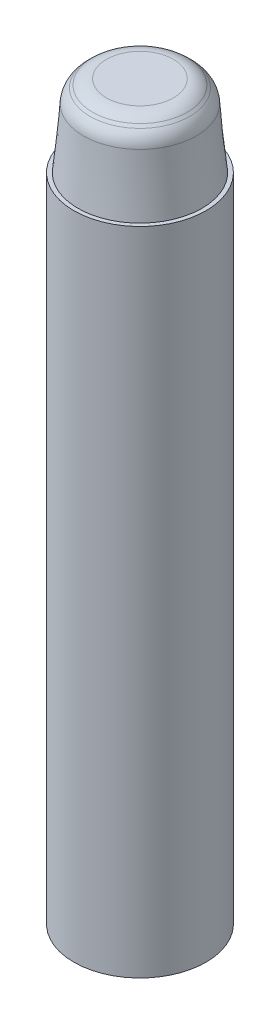
ISO-10303-21;
HEADER;
FILE_DESCRIPTION(('STEP AP214'),'2;1');
FILE_NAME('part.step','',(''),(''),'','','');
FILE_SCHEMA(('AUTOMOTIVE_DESIGN { 1 0 10303 214 1 1 1 1 }'));
ENDSEC;
DATA;
#1=APPLICATION_CONTEXT('core data for automotive mechanical design processes');
#2=APPLICATION_PROTOCOL_DEFINITION('international standard','automotive_design',2000,#1);
#3=PRODUCT_CONTEXT('',#1,'mechanical');
#4=PRODUCT('Part','Part','',(#3));
#5=PRODUCT_RELATED_PRODUCT_CATEGORY('part','',(#4));
#6=PRODUCT_DEFINITION_FORMATION('','',#4);
#7=PRODUCT_DEFINITION_CONTEXT('part definition',#1,'design');
#8=PRODUCT_DEFINITION('design','',#6,#7);
#9=PRODUCT_DEFINITION_SHAPE('','',#8);
#10=(LENGTH_UNIT() NAMED_UNIT(*) SI_UNIT(.MILLI.,.METRE.));
#11=(NAMED_UNIT(*) PLANE_ANGLE_UNIT() SI_UNIT($,.RADIAN.));
#12=(NAMED_UNIT(*) SI_UNIT($,.STERADIAN.) SOLID_ANGLE_UNIT());
#13=UNCERTAINTY_MEASURE_WITH_UNIT(LENGTH_MEASURE(1.E-05),#10,'distance_accuracy_value','');
#14=(GEOMETRIC_REPRESENTATION_CONTEXT(3) GLOBAL_UNCERTAINTY_ASSIGNED_CONTEXT((#13)) GLOBAL_UNIT_ASSIGNED_CONTEXT((#10,
#11,#12)) REPRESENTATION_CONTEXT('',''));
#15=CARTESIAN_POINT('',(0.,0.,0.));
#16=DIRECTION('',(0.,0.,1.));
#17=DIRECTION('',(1.,0.,0.));
#18=AXIS2_PLACEMENT_3D('',#15,#16,#17);
#19=CARTESIAN_POINT('',(0.,64.,0.));
#20=DIRECTION('',(0.,1.,0.));
#21=DIRECTION('',(0.,0.,1.));
#22=AXIS2_PLACEMENT_3D('',#19,#20,#21);
#23=PLANE('',#22);
#24=CARTESIAN_POINT('',(0.,64.,0.));
#25=DIRECTION('',(0.,1.,0.));
#26=DIRECTION('',(0.,0.,1.));
#27=AXIS2_PLACEMENT_3D('',#24,#25,#26);
#28=CIRCLE('',#27,6.5);
#29=CARTESIAN_POINT('',(0.,64.,6.5));
#30=VERTEX_POINT('',#29);
#31=EDGE_CURVE('E62',#30,#30,#28,.T.);
#32=ORIENTED_EDGE('',*,*,#31,.T.);
#33=EDGE_LOOP('',(#32));
#34=FACE_BOUND('',#33,.T.);
#35=CARTESIAN_POINT('',(0.,64.,0.));
#36=DIRECTION('',(0.,1.,0.));
#37=DIRECTION('',(0.,0.,1.));
#38=AXIS2_PLACEMENT_3D('',#35,#36,#37);
#39=CIRCLE('',#38,6.1);
#40=CARTESIAN_POINT('',(-6.08596086246231,64.,-0.413618641476629));
#41=VERTEX_POINT('',#40);
#42=EDGE_CURVE('E67',#41,#41,#39,.T.);
#43=ORIENTED_EDGE('',*,*,#42,.F.);
#44=EDGE_LOOP('',(#43));
#45=FACE_BOUND('',#44,.T.);
#46=ADVANCED_FACE('F43',(#34,#45),#23,.T.);
#47=CARTESIAN_POINT('',(0.,64.,0.));
#48=DIRECTION('',(0.,-1.,0.));
#49=DIRECTION('',(0.,0.,-1.));
#50=AXIS2_PLACEMENT_3D('',#47,#48,#49);
#51=CYLINDRICAL_SURFACE('',#50,6.5);
#52=ORIENTED_EDGE('',*,*,#31,.F.);
#53=EDGE_LOOP('',(#52));
#54=FACE_BOUND('',#53,.T.);
#55=CARTESIAN_POINT('',(0.,0.,0.));
#56=DIRECTION('',(0.,1.,0.));
#57=DIRECTION('',(0.,0.,1.));
#58=AXIS2_PLACEMENT_3D('',#55,#56,#57);
#59=CIRCLE('',#58,6.5);
#60=CARTESIAN_POINT('',(0.,0.,6.5));
#61=VERTEX_POINT('',#60);
#62=EDGE_CURVE('E65',#61,#61,#59,.T.);
#63=ORIENTED_EDGE('',*,*,#62,.T.);
#64=EDGE_LOOP('',(#63));
#65=FACE_BOUND('',#64,.T.);
#66=ADVANCED_FACE('F78',(#54,#65),#51,.T.);
#67=CARTESIAN_POINT('',(0.,0.,0.));
#68=DIRECTION('',(0.,1.,0.));
#69=DIRECTION('',(0.,0.,1.));
#70=AXIS2_PLACEMENT_3D('',#67,#68,#69);
#71=PLANE('',#70);
#72=ORIENTED_EDGE('',*,*,#62,.F.);
#73=EDGE_LOOP('',(#72));
#74=FACE_BOUND('',#73,.T.);
#75=ADVANCED_FACE('F83',(#74),#71,.F.);
#76=CARTESIAN_POINT('',(-5.23294248112168,70.7,-1.69301889808475));
#77=CARTESIAN_POINT('',(-6.08596086246231,64.,-0.413618641476629));
#78=CARTESIAN_POINT('',(-1.84690468495219,70.7,-12.1589038603281));
#79=CARTESIAN_POINT('',(-5.25872357950905,64.,-12.5855403664013));
#80=CARTESIAN_POINT('',(8.61898027729117,70.7,-8.77286606415861));
#81=CARTESIAN_POINT('',(6.91319814541557,64.,-11.758303083448));
#82=CARTESIAN_POINT('',(5.23294248112168,70.7,1.69301889808474));
#83=CARTESIAN_POINT('',(6.08596086246231,64.,0.413618641476629));
#84=CARTESIAN_POINT('',(1.84690468495219,70.7,12.1589038603281));
#85=CARTESIAN_POINT('',(5.25872357950905,64.,12.5855403664013));
#86=CARTESIAN_POINT('',(-8.61898027729117,70.7,8.77286606415861));
#87=CARTESIAN_POINT('',(-6.91319814541558,64.,11.758303083448));
#88=CARTESIAN_POINT('',(-5.23294248112168,70.7,-1.69301889808475));
#89=CARTESIAN_POINT('',(-6.08596086246231,64.,-0.413618641476629));
#90=(BOUNDED_SURFACE() B_SPLINE_SURFACE(3,1,((#76,#77),(#78,#79),(#80,#81),(#82,#83),(#84,#85),
(#86,#87),(#88,#89)),.UNSPECIFIED.,.T.,.F.,.F.) B_SPLINE_SURFACE_WITH_KNOTS((4,3,4),(2,2),(0.,
0.5,1.),(0.,1.),.UNSPECIFIED.) GEOMETRIC_REPRESENTATION_ITEM() RATIONAL_B_SPLINE_SURFACE(((1.,
1.),(0.333333333333333,0.333333333333333),(0.333333333333333,0.333333333333333),(1.,1.),
(0.333333333333333,0.333333333333333),(0.333333333333333,0.333333333333333),(1.,1.))) REPRESENTATION_ITEM('') SURFACE());
#91=CARTESIAN_POINT('',(0.,69.8919672858643,0.));
#92=DIRECTION('',(0.,-1.,0.));
#93=DIRECTION('',(0.,0.,-1.));
#94=AXIS2_PLACEMENT_3D('',#91,#92,#93);
#95=CIRCLE('',#94,5.55325280101119);
#96=CARTESIAN_POINT('',(-5.3358181166265,69.8919672858643,-1.53872079930669));
#97=VERTEX_POINT('',#96);
#98=EDGE_CURVE('E11',#97,#97,#95,.T.);
#99=CARTESIAN_POINT('',(-5.3358181166265,69.8919672858643,-1.53872079930669));
#100=CARTESIAN_POINT('',(-5.34363210356229,69.8305926266366,-1.52700098516263));
#101=CARTESIAN_POINT('',(-5.35144609049808,69.7692179674088,-1.51528117101857));
#102=CARTESIAN_POINT('',(-5.36707406436966,69.6464686489533,-1.49184154273044));
#103=CARTESIAN_POINT('',(-5.37488805130545,69.5850939897256,-1.48012172858638));
#104=CARTESIAN_POINT('',(-5.39051602517703,69.46234467127,-1.45668210029825));
#105=CARTESIAN_POINT('',(-5.39833001211282,69.4009700120423,-1.44496228615419));
#106=CARTESIAN_POINT('',(-5.4139579859844,69.2782206935868,-1.42152265786606));
#107=CARTESIAN_POINT('',(-5.42177197292019,69.216846034359,-1.409802843722));
#108=CARTESIAN_POINT('',(-5.43739994679177,69.0940967159035,-1.38636321543387));
#109=CARTESIAN_POINT('',(-5.44521393372756,69.0327220566758,-1.37464340128981));
#110=CARTESIAN_POINT('',(-5.46084190759914,68.9099727382203,-1.35120377300168));
#111=CARTESIAN_POINT('',(-5.46865589453493,68.8485980789925,-1.33948395885762));
#112=CARTESIAN_POINT('',(-5.48428386840651,68.725848760537,-1.31604433056949));
#113=CARTESIAN_POINT('',(-5.49209785534229,68.6644741013093,-1.30432451642543));
#114=CARTESIAN_POINT('',(-5.50772582921387,68.5417247828537,-1.2808848881373));
#115=CARTESIAN_POINT('',(-5.51553981614966,68.480350123626,-1.26916507399324));
#116=CARTESIAN_POINT('',(-5.53116779002124,68.3576008051705,-1.24572544570511));
#117=CARTESIAN_POINT('',(-5.53898177695703,68.2962261459427,-1.23400563156105));
#118=CARTESIAN_POINT('',(-5.55460975082861,68.1734768274872,-1.21056600327292));
#119=CARTESIAN_POINT('',(-5.5624237377644,68.1121021682595,-1.19884618912886));
#120=CARTESIAN_POINT('',(-5.57805171163598,67.989352849804,-1.17540656084074));
#121=CARTESIAN_POINT('',(-5.58586569857177,67.9279781905762,-1.16368674669667));
#122=CARTESIAN_POINT('',(-5.60149367244335,67.8052288721207,-1.14024711840855));
#123=CARTESIAN_POINT('',(-5.60930765937914,67.7438542128929,-1.12852730426448));
#124=CARTESIAN_POINT('',(-5.62493563325072,67.6211048944374,-1.10508767597636));
#125=CARTESIAN_POINT('',(-5.63274962018651,67.5597302352097,-1.09336786183229));
#126=CARTESIAN_POINT('',(-5.64837759405809,67.4369809167542,-1.06992823354417));
#127=CARTESIAN_POINT('',(-5.65619158099388,67.3756062575264,-1.0582084194001));
#128=CARTESIAN_POINT('',(-5.67181955486546,67.2528569390709,-1.03476879111198));
#129=CARTESIAN_POINT('',(-5.67963354180125,67.1914822798432,-1.02304897696791));
#130=CARTESIAN_POINT('',(-5.69526151567283,67.0687329613877,-0.999609348679788));
#131=CARTESIAN_POINT('',(-5.70307550260862,67.0073583021599,-0.987889534535725));
#132=CARTESIAN_POINT('',(-5.7187034764802,66.8846089837044,-0.964449906247599));
#133=CARTESIAN_POINT('',(-5.72651746341599,66.8232343244766,-0.952730092103536));
#134=CARTESIAN_POINT('',(-5.74214543728757,66.7004850060211,-0.929290463815409));
#135=CARTESIAN_POINT('',(-5.74995942422335,66.6391103467934,-0.917570649671345));
#136=CARTESIAN_POINT('',(-5.76558739809493,66.5163610283379,-0.894131021383219));
#137=CARTESIAN_POINT('',(-5.77340138503072,66.4549863691101,-0.882411207239156));
#138=CARTESIAN_POINT('',(-5.7890293589023,66.3322370506546,-0.85897157895103));
#139=CARTESIAN_POINT('',(-5.79684334583809,66.2708623914269,-0.847251764806967));
#140=CARTESIAN_POINT('',(-5.81247131970967,66.1481130729714,-0.82381213651884));
#141=CARTESIAN_POINT('',(-5.82028530664546,66.0867384137436,-0.812092322374777));
#142=CARTESIAN_POINT('',(-5.83591328051704,65.9639890952881,-0.788652694086651));
#143=CARTESIAN_POINT('',(-5.84372726745283,65.9026144360603,-0.776932879942588));
#144=CARTESIAN_POINT('',(-5.85935524132441,65.7798651176048,-0.753493251654461));
#145=CARTESIAN_POINT('',(-5.8671692282602,65.7184904583771,-0.741773437510398));
#146=CARTESIAN_POINT('',(-5.88279720213178,65.5957411399216,-0.718333809222272));
#147=CARTESIAN_POINT('',(-5.89061118906757,65.5343664806938,-0.706613995078209));
#148=CARTESIAN_POINT('',(-5.90623916293915,65.4116171622383,-0.683174366790082));
#149=CARTESIAN_POINT('',(-5.91405314987494,65.3502425030106,-0.671454552646019));
#150=CARTESIAN_POINT('',(-5.92968112374652,65.2274931845551,-0.648014924357892));
#151=CARTESIAN_POINT('',(-5.93749511068231,65.1661185253273,-0.63629511021383));
#152=CARTESIAN_POINT('',(-5.95312308455389,65.0433692068718,-0.612855481925704));
#153=CARTESIAN_POINT('',(-5.96093707148968,64.981994547644,-0.60113566778164));
#154=CARTESIAN_POINT('',(-5.97656504536126,64.8592452291885,-0.577696039493514));
#155=CARTESIAN_POINT('',(-5.98437903229705,64.7978705699608,-0.56597622534945));
#156=CARTESIAN_POINT('',(-6.00000700616863,64.6751212515053,-0.542536597061325));
#157=CARTESIAN_POINT('',(-6.00782099310442,64.6137465922775,-0.530816782917262));
#158=CARTESIAN_POINT('',(-6.02344896697599,64.490997273822,-0.507377154629135));
#159=CARTESIAN_POINT('',(-6.03126295391178,64.4296226145943,-0.495657340485071));
#160=CARTESIAN_POINT('',(-6.04689092778336,64.3068732961388,-0.472217712196945));
#161=CARTESIAN_POINT('',(-6.05470491471915,64.245498636911,-0.460497898052882));
#162=CARTESIAN_POINT('',(-6.07033288859073,64.1227493184555,-0.437058269764756));
#163=CARTESIAN_POINT('',(-6.07814687552652,64.0613746592278,-0.425338455620693));
#164=CARTESIAN_POINT('',(-6.08596086246231,64.,-0.413618641476629));
#165=B_SPLINE_CURVE_WITH_KNOTS('',3,(#99,#100,#101,#102,#103,#104,#105,#106,#107,#108,#109,#110,
#111,#112,#113,#114,#115,#116,#117,#118,#119,#120,#121,#122,#123,#124,#125,#126,#127,#128,#129,
#130,#131,#132,#133,#134,#135,#136,#137,#138,#139,#140,#141,#142,#143,#144,#145,#146,#147,#148,
#149,#150,#151,#152,#153,#154,#155,#156,#157,#158,#159,#160,#161,#162,#163,#164),.UNSPECIFIED.,
.F.,.F.,(4,2,2,2,2,2,2,2,2,2,2,2,2,2,2,2,2,2,2,2,2,2,2,2,2,2,2,2,2,2,2,2,4),(0.,
0.188910960710431,0.377821921420875,0.56673288213132,0.755643842841764,0.944554803552208,
1.13346576426264,1.32237672497308,1.51128768568353,1.70019864639397,1.88910960710442,
2.07802056781486,2.26693152852531,2.45584248923574,2.64475344994618,2.83366441065663,
3.02257537136707,3.21148633207751,3.40039729278795,3.58930825349839,3.77821921420883,
3.96713017491928,4.15604113562972,4.34495209634017,4.53386305705061,4.72277401776104,
4.91168497847149,5.10059593918193,5.28950689989238,5.47841786060282,5.66732882131325,
5.8562397820237,6.04515074273414),.UNSPECIFIED.);
#166=EDGE_CURVE('BSEAM71',#97,#41,#165,.T.);
#167=ORIENTED_EDGE('',*,*,#98,.T.);
#168=ORIENTED_EDGE('',*,*,#42,.T.);
#169=ORIENTED_EDGE('',*,*,#166,.T.);
#170=ORIENTED_EDGE('',*,*,#166,.F.);
#171=EDGE_LOOP('',(#167,#169,#168,#170));
#172=FACE_BOUND('',#171,.T.);
#173=ADVANCED_FACE('F71',(#172),#90,.T.);
#174=CARTESIAN_POINT('',(0.,72.,0.));
#175=DIRECTION('',(0.,1.,0.));
#176=DIRECTION('',(0.,0.,1.));
#177=AXIS2_PLACEMENT_3D('',#174,#175,#176);
#178=PLANE('',#177);
#179=CARTESIAN_POINT('',(0.,72.,0.));
#180=DIRECTION('',(0.,1.,0.));
#181=DIRECTION('',(0.,0.,1.));
#182=AXIS2_PLACEMENT_3D('',#179,#180,#181);
#183=CIRCLE('',#182,3.29116731452139);
#184=CARTESIAN_POINT('',(0.,72.,3.29116731452139));
#185=VERTEX_POINT('',#184);
#186=EDGE_CURVE('E59',#185,#185,#183,.T.);
#187=ORIENTED_EDGE('',*,*,#186,.T.);
#188=EDGE_LOOP('',(#187));
#189=FACE_BOUND('',#188,.T.);
#190=ADVANCED_FACE('F103',(#189),#178,.T.);
#191=CARTESIAN_POINT('',(-4.13929351190348,70.7,-3.62163626311558));
#192=CARTESIAN_POINT('',(-3.56138920919658,72.,-2.03138054057287));
#193=CARTESIAN_POINT('',(-11.3825660381346,70.7,4.65695076069137));
#194=CARTESIAN_POINT('',(-7.62415029034232,72.,5.0913978778203));
#195=CARTESIAN_POINT('',(-3.10397901432768,70.7,11.9002232869225));
#196=CARTESIAN_POINT('',(-0.501371871949154,72.,9.15415895896604));
#197=CARTESIAN_POINT('',(4.13929351190348,70.7,3.62163626311558));
#198=CARTESIAN_POINT('',(3.56138920919658,72.,2.03138054057287));
#199=CARTESIAN_POINT('',(11.3825660381346,70.7,-4.65695076069137));
#200=CARTESIAN_POINT('',(7.62415029034232,72.,-5.0913978778203));
#201=CARTESIAN_POINT('',(3.10397901432768,70.7,-11.9002232869225));
#202=CARTESIAN_POINT('',(0.501371871949155,72.,-9.15415895896604));
#203=CARTESIAN_POINT('',(-4.13929351190348,70.7,-3.62163626311558));
#204=CARTESIAN_POINT('',(-3.56138920919658,72.,-2.03138054057287));
#205=(BOUNDED_SURFACE() B_SPLINE_SURFACE(3,1,((#191,#192),(#193,#194),(#195,#196),(#197,#198),
(#199,#200),(#201,#202),(#203,#204)),.UNSPECIFIED.,.T.,.F.,.F.) B_SPLINE_SURFACE_WITH_KNOTS((4,
3,4),(2,2),(0.,0.5,1.),(0.,1.),
.UNSPECIFIED.) GEOMETRIC_REPRESENTATION_ITEM() RATIONAL_B_SPLINE_SURFACE(((1.,1.),
(0.333333333333334,0.333333333333333),(0.333333333333334,0.333333333333333),(1.,1.),
(0.333333333333333,0.333333333333333),(0.333333333333333,0.333333333333333),(1.,1.))) REPRESENTATION_ITEM('') SURFACE());
#206=CARTESIAN_POINT('',(0.,71.2301830027243,0.));
#207=DIRECTION('',(0.,1.,0.));
#208=DIRECTION('',(0.,0.,1.));
#209=AXIS2_PLACEMENT_3D('',#206,#207,#208);
#210=CIRCLE('',#209,4.9068647054859);
#211=CARTESIAN_POINT('',(-3.90360502075235,71.2301830027244,-2.97307737536382));
#212=VERTEX_POINT('',#211);
#213=EDGE_CURVE('E49',#212,#212,#210,.T.);
#214=CARTESIAN_POINT('',(0.,71.4609605348521,0.));
#215=DIRECTION('',(0.,1.,0.));
#216=DIRECTION('',(0.,0.,1.));
#217=AXIS2_PLACEMENT_3D('',#214,#215,#216);
#218=CIRCLE('',#217,4.65703491996656);
#219=CARTESIAN_POINT('',(-3.80101476784102,71.4609605348521,-2.6907733052865));
#220=VERTEX_POINT('',#219);
#221=EDGE_CURVE('E53',#220,#220,#218,.F.);
#222=CARTESIAN_POINT('',(-3.90360502075235,71.2301830027244,-2.97307737536382));
#223=CARTESIAN_POINT('',(-3.90253637228452,71.2325869353507,-2.97013670796718));
#224=CARTESIAN_POINT('',(-3.9014677238167,71.234990867977,-2.96719604057054));
#225=CARTESIAN_POINT('',(-3.89933042688104,71.2397987332297,-2.96131470577726));
#226=CARTESIAN_POINT('',(-3.89826177841322,71.242202665856,-2.95837403838063));
#227=CARTESIAN_POINT('',(-3.89612448147757,71.2470105311087,-2.95249270358735));
#228=CARTESIAN_POINT('',(-3.89505583300974,71.249414463735,-2.94955203619071));
#229=CARTESIAN_POINT('',(-3.89291853607409,71.2542223289877,-2.94367070139743));
#230=CARTESIAN_POINT('',(-3.89184988760626,71.256626261614,-2.94073003400079));
#231=CARTESIAN_POINT('',(-3.88971259067061,71.2614341268667,-2.93484869920752));
#232=CARTESIAN_POINT('',(-3.88864394220278,71.263838059493,-2.93190803181088));
#233=CARTESIAN_POINT('',(-3.88650664526713,71.2686459247457,-2.9260266970176));
#234=CARTESIAN_POINT('',(-3.8854379967993,71.271049857372,-2.92308602962096));
#235=CARTESIAN_POINT('',(-3.88330069986365,71.2758577226247,-2.91720469482768));
#236=CARTESIAN_POINT('',(-3.88223205139582,71.278261655251,-2.91426402743104));
#237=CARTESIAN_POINT('',(-3.88009475446017,71.2830695205037,-2.90838269263777));
#238=CARTESIAN_POINT('',(-3.87902610599234,71.28547345313,-2.90544202524113));
#239=CARTESIAN_POINT('',(-3.87688880905669,71.2902813183827,-2.89956069044785));
#240=CARTESIAN_POINT('',(-3.87582016058886,71.292685251009,-2.89662002305121));
#241=CARTESIAN_POINT('',(-3.87368286365321,71.2974931162616,-2.89073868825793));
#242=CARTESIAN_POINT('',(-3.87261421518539,71.299897048888,-2.8877980208613));
#243=CARTESIAN_POINT('',(-3.87047691824973,71.3047049141406,-2.88191668606802));
#244=CARTESIAN_POINT('',(-3.86940826978191,71.307108846767,-2.87897601867138));
#245=CARTESIAN_POINT('',(-3.86727097284625,71.3119167120196,-2.8730946838781));
#246=CARTESIAN_POINT('',(-3.86620232437843,71.3143206446459,-2.87015401648146));
#247=CARTESIAN_POINT('',(-3.86406502744277,71.3191285098986,-2.86427268168819));
#248=CARTESIAN_POINT('',(-3.86299637897495,71.3215324425249,-2.86133201429155));
#249=CARTESIAN_POINT('',(-3.86085908203929,71.3263403077776,-2.85545067949827));
#250=CARTESIAN_POINT('',(-3.85979043357147,71.3287442404039,-2.85251001210163));
#251=CARTESIAN_POINT('',(-3.85765313663582,71.3335521056566,-2.84662867730835));
#252=CARTESIAN_POINT('',(-3.85658448816799,71.3359560382829,-2.84368800991171));
#253=CARTESIAN_POINT('',(-3.85444719123234,71.3407639035356,-2.83780667511843));
#254=CARTESIAN_POINT('',(-3.85337854276451,71.3431678361619,-2.8348660077218));
#255=CARTESIAN_POINT('',(-3.85124124582886,71.3479757014146,-2.82898467292852));
#256=CARTESIAN_POINT('',(-3.85017259736103,71.3503796340409,-2.82604400553188));
#257=CARTESIAN_POINT('',(-3.84803530042538,71.3551874992936,-2.8201626707386));
#258=CARTESIAN_POINT('',(-3.84696665195755,71.3575914319199,-2.81722200334196));
#259=CARTESIAN_POINT('',(-3.8448293550219,71.3623992971726,-2.81134066854869));
#260=CARTESIAN_POINT('',(-3.84376070655407,71.3648032297989,-2.80840000115205));
#261=CARTESIAN_POINT('',(-3.84162340961842,71.3696110950516,-2.80251866635877));
#262=CARTESIAN_POINT('',(-3.84055476115059,71.3720150276779,-2.79957799896213));
#263=CARTESIAN_POINT('',(-3.83841746421494,71.3768228929306,-2.79369666416885));
#264=CARTESIAN_POINT('',(-3.83734881574711,71.3792268255569,-2.79075599677222));
#265=CARTESIAN_POINT('',(-3.83521151881146,71.3840346908096,-2.78487466197894));
#266=CARTESIAN_POINT('',(-3.83414287034363,71.3864386234359,-2.7819339945823));
#267=CARTESIAN_POINT('',(-3.83200557340798,71.3912464886886,-2.77605265978902));
#268=CARTESIAN_POINT('',(-3.83093692494016,71.3936504213149,-2.77311199239238));
#269=CARTESIAN_POINT('',(-3.8287996280045,71.3984582865676,-2.76723065759911));
#270=CARTESIAN_POINT('',(-3.82773097953668,71.4008622191939,-2.76428999020247));
#271=CARTESIAN_POINT('',(-3.82559368260102,71.4056700844466,-2.75840865540919));
#272=CARTESIAN_POINT('',(-3.8245250341332,71.4080740170729,-2.75546798801255));
#273=CARTESIAN_POINT('',(-3.82238773719754,71.4128818823256,-2.74958665321927));
#274=CARTESIAN_POINT('',(-3.82131908872972,71.4152858149519,-2.74664598582263));
#275=CARTESIAN_POINT('',(-3.81918179179406,71.4200936802045,-2.74076465102936));
#276=CARTESIAN_POINT('',(-3.81811314332624,71.4224976128309,-2.73782398363272));
#277=CARTESIAN_POINT('',(-3.81597584639059,71.4273054780835,-2.73194264883944));
#278=CARTESIAN_POINT('',(-3.81490719792276,71.4297094107098,-2.7290019814428));
#279=CARTESIAN_POINT('',(-3.81276990098711,71.4345172759625,-2.72312064664952));
#280=CARTESIAN_POINT('',(-3.81170125251928,71.4369212085888,-2.72017997925288));
#281=CARTESIAN_POINT('',(-3.80956395558363,71.4417290738415,-2.71429864445961));
#282=CARTESIAN_POINT('',(-3.8084953071158,71.4441330064678,-2.71135797706297));
#283=CARTESIAN_POINT('',(-3.80635801018015,71.4489408717205,-2.70547664226969));
#284=CARTESIAN_POINT('',(-3.80528936171232,71.4513448043468,-2.70253597487305));
#285=CARTESIAN_POINT('',(-3.80315206477667,71.4561526695995,-2.69665464007978));
#286=CARTESIAN_POINT('',(-3.80208341630884,71.4585566022258,-2.69371397268314));
#287=CARTESIAN_POINT('',(-3.80101476784102,71.4609605348521,-2.6907733052865));
#288=B_SPLINE_CURVE_WITH_KNOTS('',3,(#222,#223,#224,#225,#226,#227,#228,#229,#230,#231,#232,
#233,#234,#235,#236,#237,#238,#239,#240,#241,#242,#243,#244,#245,#246,#247,#248,#249,#250,#251,
#252,#253,#254,#255,#256,#257,#258,#259,#260,#261,#262,#263,#264,#265,#266,#267,#268,#269,#270,
#271,#272,#273,#274,#275,#276,#277,#278,#279,#280,#281,#282,#283,#284,#285,#286,#287),
.UNSPECIFIED.,.F.,.F.,(4,2,2,2,2,2,2,2,2,2,2,2,2,2,2,2,2,2,2,2,2,2,2,2,2,2,2,2,2,2,2,2,4),(0.,
0.0118370535698804,0.0236741071397771,0.0355111607096659,0.0473482142795544,0.0591852678494428,
0.0710223214193401,0.0828593749892289,0.0946964285591177,0.106533482129006,0.118370535698894,
0.130207589268783,0.142044642838672,0.153881696408561,0.165718749978449,0.177555803548338,
0.189392857118227,0.201229910688124,0.213066964258012,0.224904017827901,0.23674107139779,
0.248578124967687,0.260415178537576,0.272252232107464,0.284089285677353,0.295926339247241,
0.30776339281713,0.319600446387019,0.331437499956907,0.343274553526796,0.355111607096685,
0.366948660666582,0.378785714236462),.UNSPECIFIED.);
#289=EDGE_CURVE('BSEAM92',#212,#220,#288,.T.);
#290=ORIENTED_EDGE('',*,*,#213,.T.);
#291=ORIENTED_EDGE('',*,*,#221,.T.);
#292=ORIENTED_EDGE('',*,*,#289,.T.);
#293=ORIENTED_EDGE('',*,*,#289,.F.);
#294=EDGE_LOOP('',(#290,#292,#291,#293));
#295=FACE_BOUND('',#294,.T.);
#296=ADVANCED_FACE('F92',(#295),#205,.T.);
#297=CARTESIAN_POINT('',(0.,70.,0.));
#298=DIRECTION('',(0.,1.,0.));
#299=DIRECTION('',(0.,0.,1.));
#300=AXIS2_PLACEMENT_3D('',#297,#298,#299);
#301=TOROIDAL_SURFACE('',#300,3.29116731452139,2.);
#302=ORIENTED_EDGE('',*,*,#221,.F.);
#303=EDGE_LOOP('',(#302));
#304=FACE_BOUND('',#303,.T.);
#305=ORIENTED_EDGE('',*,*,#186,.F.);
#306=EDGE_LOOP('',(#305));
#307=FACE_BOUND('',#306,.T.);
#308=ADVANCED_FACE('F91',(#304,#307),#301,.T.);
#309=CARTESIAN_POINT('',(0.,69.7534597975013,0.));
#310=DIRECTION('',(0.,-1.,0.));
#311=DIRECTION('',(0.,0.,-1.));
#312=AXIS2_PLACEMENT_3D('',#309,#310,#311);
#313=TOROIDAL_SURFACE('',#312,3.55805464652443,2.);
#314=ORIENTED_EDGE('',*,*,#98,.F.);
#315=EDGE_LOOP('',(#314));
#316=FACE_BOUND('',#315,.T.);
#317=ORIENTED_EDGE('',*,*,#213,.F.);
#318=EDGE_LOOP('',(#317));
#319=FACE_BOUND('',#318,.T.);
#320=ADVANCED_FACE('F44',(#316,#319),#313,.T.);
#321=CLOSED_SHELL('',(#46,#66,#75,#173,#190,#296,#308,#320));
#322=MANIFOLD_SOLID_BREP('B2',#321);
#323=ADVANCED_BREP_SHAPE_REPRESENTATION('',(#18,#322),#14);
#324=SHAPE_DEFINITION_REPRESENTATION(#9,#323);
ENDSEC;
END-ISO-10303-21;
